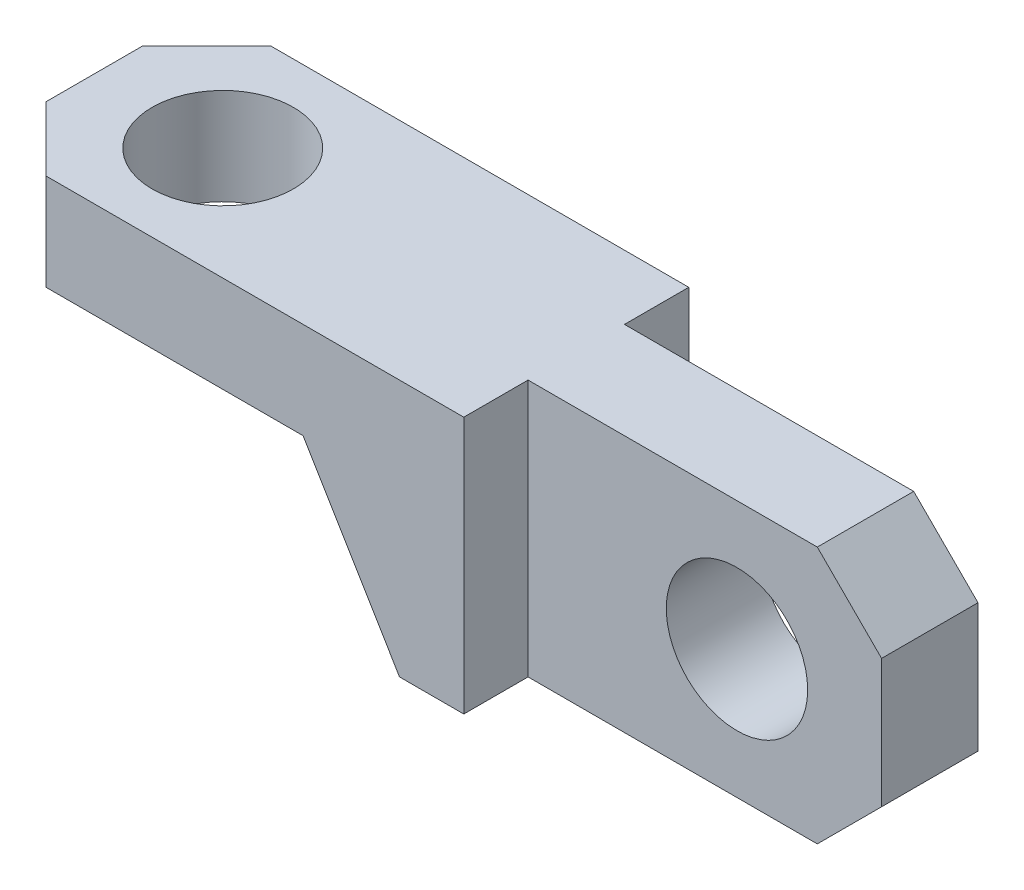
ISO-10303-21;
HEADER;
FILE_DESCRIPTION(('STEP AP214'),'2;1');
FILE_NAME('part.step','',(''),(''),'','','');
FILE_SCHEMA(('AUTOMOTIVE_DESIGN { 1 0 10303 214 1 1 1 1 }'));
ENDSEC;
DATA;
#1=APPLICATION_CONTEXT('core data for automotive mechanical design processes');
#2=APPLICATION_PROTOCOL_DEFINITION('international standard','automotive_design',2000,#1);
#3=PRODUCT_CONTEXT('',#1,'mechanical');
#4=PRODUCT('Part','Part','',(#3));
#5=PRODUCT_RELATED_PRODUCT_CATEGORY('part','',(#4));
#6=PRODUCT_DEFINITION_FORMATION('','',#4);
#7=PRODUCT_DEFINITION_CONTEXT('part definition',#1,'design');
#8=PRODUCT_DEFINITION('design','',#6,#7);
#9=PRODUCT_DEFINITION_SHAPE('','',#8);
#10=(LENGTH_UNIT() NAMED_UNIT(*) SI_UNIT(.MILLI.,.METRE.));
#11=(NAMED_UNIT(*) PLANE_ANGLE_UNIT() SI_UNIT($,.RADIAN.));
#12=(NAMED_UNIT(*) SI_UNIT($,.STERADIAN.) SOLID_ANGLE_UNIT());
#13=UNCERTAINTY_MEASURE_WITH_UNIT(LENGTH_MEASURE(1.E-05),#10,'distance_accuracy_value','');
#14=(GEOMETRIC_REPRESENTATION_CONTEXT(3) GLOBAL_UNCERTAINTY_ASSIGNED_CONTEXT((#13)) GLOBAL_UNIT_ASSIGNED_CONTEXT((#10,
#11,#12)) REPRESENTATION_CONTEXT('',''));
#15=CARTESIAN_POINT('',(0.,0.,0.));
#16=DIRECTION('',(0.,0.,1.));
#17=DIRECTION('',(1.,0.,0.));
#18=AXIS2_PLACEMENT_3D('',#15,#16,#17);
#19=CARTESIAN_POINT('',(0.,10.16,0.));
#20=DIRECTION('',(0.,-1.,0.));
#21=DIRECTION('',(0.,0.,-1.));
#22=AXIS2_PLACEMENT_3D('',#19,#20,#21);
#23=PLANE('',#22);
#24=DIRECTION('',(-1.,0.,0.));
#25=VECTOR('',#24,1.);
#26=CARTESIAN_POINT('',(0.,10.16,-8.89));
#27=LINE('',#26,#25);
#28=CARTESIAN_POINT('',(19.05,10.16,-8.89));
#29=VERTEX_POINT('',#28);
#30=CARTESIAN_POINT('',(2.54000000000001,10.16,-8.89));
#31=VERTEX_POINT('',#30);
#32=EDGE_CURVE('E190',#29,#31,#27,.T.);
#33=ORIENTED_EDGE('',*,*,#32,.T.);
#34=DIRECTION('',(0.707106781186549,0.,-0.707106781186546));
#35=VECTOR('',#34,1.);
#36=CARTESIAN_POINT('',(0.,10.16,-6.35));
#37=LINE('',#36,#35);
#38=CARTESIAN_POINT('',(0.,10.16,-6.35));
#39=VERTEX_POINT('',#38);
#40=EDGE_CURVE('E250',#31,#39,#37,.F.);
#41=ORIENTED_EDGE('',*,*,#40,.T.);
#42=DIRECTION('',(0.,0.,1.));
#43=VECTOR('',#42,1.);
#44=CARTESIAN_POINT('',(0.,10.16,0.));
#45=LINE('',#44,#43);
#46=CARTESIAN_POINT('',(0.,10.16,-2.54000000000001));
#47=VERTEX_POINT('',#46);
#48=EDGE_CURVE('E204',#39,#47,#45,.T.);
#49=ORIENTED_EDGE('',*,*,#48,.T.);
#50=DIRECTION('',(-0.707106781186546,0.,-0.707106781186549));
#51=VECTOR('',#50,1.);
#52=CARTESIAN_POINT('',(2.54,10.16,0.));
#53=LINE('',#52,#51);
#54=CARTESIAN_POINT('',(2.54,10.16,0.));
#55=VERTEX_POINT('',#54);
#56=EDGE_CURVE('E247',#47,#55,#53,.F.);
#57=ORIENTED_EDGE('',*,*,#56,.T.);
#58=DIRECTION('',(1.,0.,0.));
#59=VECTOR('',#58,1.);
#60=CARTESIAN_POINT('',(0.,10.16,0.));
#61=LINE('',#60,#59);
#62=CARTESIAN_POINT('',(19.05,10.16,0.));
#63=VERTEX_POINT('',#62);
#64=EDGE_CURVE('E301',#55,#63,#61,.T.);
#65=ORIENTED_EDGE('',*,*,#64,.T.);
#66=DIRECTION('',(0.,0.,-1.));
#67=VECTOR('',#66,1.);
#68=CARTESIAN_POINT('',(19.05,10.16,0.));
#69=LINE('',#68,#67);
#70=CARTESIAN_POINT('',(19.05,10.16,-2.54));
#71=VERTEX_POINT('',#70);
#72=EDGE_CURVE('E285',#63,#71,#69,.T.);
#73=ORIENTED_EDGE('',*,*,#72,.T.);
#74=DIRECTION('',(1.,0.,0.));
#75=VECTOR('',#74,1.);
#76=CARTESIAN_POINT('',(19.05,10.16,-2.54));
#77=LINE('',#76,#75);
#78=CARTESIAN_POINT('',(30.48,10.16,-2.54));
#79=VERTEX_POINT('',#78);
#80=EDGE_CURVE('E276',#71,#79,#77,.T.);
#81=ORIENTED_EDGE('',*,*,#80,.T.);
#82=DIRECTION('',(0.,0.,-1.));
#83=VECTOR('',#82,1.);
#84=CARTESIAN_POINT('',(30.48,10.16,0.));
#85=LINE('',#84,#83);
#86=CARTESIAN_POINT('',(30.48,10.16,-6.35));
#87=VERTEX_POINT('',#86);
#88=EDGE_CURVE('E243',#79,#87,#85,.T.);
#89=ORIENTED_EDGE('',*,*,#88,.T.);
#90=DIRECTION('',(-1.,0.,0.));
#91=VECTOR('',#90,1.);
#92=CARTESIAN_POINT('',(19.05,10.16,-6.35));
#93=LINE('',#92,#91);
#94=CARTESIAN_POINT('',(19.05,10.16,-6.35));
#95=VERTEX_POINT('',#94);
#96=EDGE_CURVE('E288',#87,#95,#93,.T.);
#97=ORIENTED_EDGE('',*,*,#96,.T.);
#98=DIRECTION('',(0.,0.,-1.));
#99=VECTOR('',#98,1.);
#100=CARTESIAN_POINT('',(19.05,10.16,-8.89));
#101=LINE('',#100,#99);
#102=EDGE_CURVE('E337',#95,#29,#101,.T.);
#103=ORIENTED_EDGE('',*,*,#102,.T.);
#104=EDGE_LOOP('',(#33,#41,#49,#57,#65,#73,#81,#89,#97,#103));
#105=FACE_BOUND('',#104,.T.);
#106=CARTESIAN_POINT('',(5.08,10.16,-4.445));
#107=DIRECTION('',(0.,1.,0.));
#108=DIRECTION('',(0.,0.,1.));
#109=AXIS2_PLACEMENT_3D('',#106,#107,#108);
#110=CIRCLE('',#109,2.794);
#111=CARTESIAN_POINT('',(5.08,10.16,-1.651));
#112=VERTEX_POINT('',#111);
#113=EDGE_CURVE('E180',#112,#112,#110,.T.);
#114=ORIENTED_EDGE('',*,*,#113,.F.);
#115=EDGE_LOOP('',(#114));
#116=FACE_BOUND('',#115,.T.);
#117=ADVANCED_FACE('F47',(#105,#116),#23,.F.);
#118=CARTESIAN_POINT('',(0.,0.,0.));
#119=DIRECTION('',(0.,-1.,0.));
#120=DIRECTION('',(0.,0.,-1.));
#121=AXIS2_PLACEMENT_3D('',#118,#119,#120);
#122=PLANE('',#121);
#123=DIRECTION('',(-1.,0.,0.));
#124=VECTOR('',#123,1.);
#125=CARTESIAN_POINT('',(19.05,0.,-6.35));
#126=LINE('',#125,#124);
#127=CARTESIAN_POINT('',(30.48,0.,-6.35));
#128=VERTEX_POINT('',#127);
#129=CARTESIAN_POINT('',(19.05,0.,-6.35));
#130=VERTEX_POINT('',#129);
#131=EDGE_CURVE('E195',#128,#130,#126,.T.);
#132=ORIENTED_EDGE('',*,*,#131,.F.);
#133=DIRECTION('',(0.,0.,1.));
#134=VECTOR('',#133,1.);
#135=CARTESIAN_POINT('',(30.48,0.,-2.54));
#136=LINE('',#135,#134);
#137=CARTESIAN_POINT('',(30.48,0.,-2.54));
#138=VERTEX_POINT('',#137);
#139=EDGE_CURVE('E64',#128,#138,#136,.T.);
#140=ORIENTED_EDGE('',*,*,#139,.T.);
#141=DIRECTION('',(1.,0.,0.));
#142=VECTOR('',#141,1.);
#143=CARTESIAN_POINT('',(19.05,0.,-2.54));
#144=LINE('',#143,#142);
#145=CARTESIAN_POINT('',(19.05,0.,-2.54));
#146=VERTEX_POINT('',#145);
#147=EDGE_CURVE('E184',#146,#138,#144,.T.);
#148=ORIENTED_EDGE('',*,*,#147,.F.);
#149=DIRECTION('',(0.,0.,-1.));
#150=VECTOR('',#149,1.);
#151=CARTESIAN_POINT('',(19.05,0.,0.));
#152=LINE('',#151,#150);
#153=CARTESIAN_POINT('',(19.05,0.,0.));
#154=VERTEX_POINT('',#153);
#155=EDGE_CURVE('E178',#154,#146,#152,.T.);
#156=ORIENTED_EDGE('',*,*,#155,.F.);
#157=DIRECTION('',(1.,0.,0.));
#158=VECTOR('',#157,1.);
#159=CARTESIAN_POINT('',(0.,0.,0.));
#160=LINE('',#159,#158);
#161=CARTESIAN_POINT('',(16.51,0.,0.));
#162=VERTEX_POINT('',#161);
#163=EDGE_CURVE('E169',#162,#154,#160,.T.);
#164=ORIENTED_EDGE('',*,*,#163,.F.);
#165=DIRECTION('',(0.,0.,1.));
#166=VECTOR('',#165,1.);
#167=CARTESIAN_POINT('',(16.51,0.,-8.891));
#168=LINE('',#167,#166);
#169=CARTESIAN_POINT('',(16.51,0.,-8.89));
#170=VERTEX_POINT('',#169);
#171=EDGE_CURVE('E150',#170,#162,#168,.T.);
#172=ORIENTED_EDGE('',*,*,#171,.F.);
#173=DIRECTION('',(-1.,0.,0.));
#174=VECTOR('',#173,1.);
#175=CARTESIAN_POINT('',(0.,0.,-8.89));
#176=LINE('',#175,#174);
#177=CARTESIAN_POINT('',(19.05,0.,-8.89));
#178=VERTEX_POINT('',#177);
#179=EDGE_CURVE('E201',#178,#170,#176,.T.);
#180=ORIENTED_EDGE('',*,*,#179,.F.);
#181=DIRECTION('',(0.,0.,-1.));
#182=VECTOR('',#181,1.);
#183=CARTESIAN_POINT('',(19.05,0.,-8.89));
#184=LINE('',#183,#182);
#185=EDGE_CURVE('E198',#130,#178,#184,.T.);
#186=ORIENTED_EDGE('',*,*,#185,.F.);
#187=EDGE_LOOP('',(#132,#140,#148,#156,#164,#172,#180,#186));
#188=FACE_BOUND('',#187,.T.);
#189=ADVANCED_FACE('F177',(#188),#122,.T.);
#190=CARTESIAN_POINT('',(0.,10.16,0.));
#191=DIRECTION('',(1.,0.,0.));
#192=DIRECTION('',(0.,0.,-1.));
#193=AXIS2_PLACEMENT_3D('',#190,#191,#192);
#194=PLANE('',#193);
#195=ORIENTED_EDGE('',*,*,#48,.F.);
#196=DIRECTION('',(0.,-1.,0.));
#197=VECTOR('',#196,1.);
#198=CARTESIAN_POINT('',(0.,10.16,-6.35));
#199=LINE('',#198,#197);
#200=CARTESIAN_POINT('',(0.,6.35,-6.35));
#201=VERTEX_POINT('',#200);
#202=EDGE_CURVE('E230',#39,#201,#199,.T.);
#203=ORIENTED_EDGE('',*,*,#202,.T.);
#204=DIRECTION('',(0.,0.,1.));
#205=VECTOR('',#204,1.);
#206=CARTESIAN_POINT('',(0.,6.35,-8.891));
#207=LINE('',#206,#205);
#208=CARTESIAN_POINT('',(0.,6.35,-2.54000000000001));
#209=VERTEX_POINT('',#208);
#210=EDGE_CURVE('E313',#201,#209,#207,.T.);
#211=ORIENTED_EDGE('',*,*,#210,.T.);
#212=DIRECTION('',(0.,1.,0.));
#213=VECTOR('',#212,1.);
#214=CARTESIAN_POINT('',(0.,10.16,-2.54000000000001));
#215=LINE('',#214,#213);
#216=EDGE_CURVE('E227',#209,#47,#215,.T.);
#217=ORIENTED_EDGE('',*,*,#216,.T.);
#218=EDGE_LOOP('',(#195,#203,#211,#217));
#219=FACE_BOUND('',#218,.T.);
#220=ADVANCED_FACE('F316',(#219),#194,.F.);
#221=CARTESIAN_POINT('',(0.,10.16,0.));
#222=DIRECTION('',(0.,0.,-1.));
#223=DIRECTION('',(-1.,0.,0.));
#224=AXIS2_PLACEMENT_3D('',#221,#222,#223);
#225=PLANE('',#224);
#226=ORIENTED_EDGE('',*,*,#64,.F.);
#227=DIRECTION('',(0.,-1.,0.));
#228=VECTOR('',#227,1.);
#229=CARTESIAN_POINT('',(2.54,10.16,0.));
#230=LINE('',#229,#228);
#231=CARTESIAN_POINT('',(2.54,6.35,0.));
#232=VERTEX_POINT('',#231);
#233=EDGE_CURVE('E253',#55,#232,#230,.T.);
#234=ORIENTED_EDGE('',*,*,#233,.T.);
#235=DIRECTION('',(-1.,0.,0.));
#236=VECTOR('',#235,1.);
#237=CARTESIAN_POINT('',(0.,6.35,0.));
#238=LINE('',#237,#236);
#239=CARTESIAN_POINT('',(12.7,6.35,0.));
#240=VERTEX_POINT('',#239);
#241=EDGE_CURVE('E163',#240,#232,#238,.T.);
#242=ORIENTED_EDGE('',*,*,#241,.F.);
#243=DIRECTION('',(-0.514495755427526,0.857492925712544,0.));
#244=VECTOR('',#243,1.);
#245=CARTESIAN_POINT('',(12.7,6.35,0.));
#246=LINE('',#245,#244);
#247=EDGE_CURVE('E154',#162,#240,#246,.T.);
#248=ORIENTED_EDGE('',*,*,#247,.F.);
#249=ORIENTED_EDGE('',*,*,#163,.T.);
#250=DIRECTION('',(0.,-1.,0.));
#251=VECTOR('',#250,1.);
#252=CARTESIAN_POINT('',(19.05,10.16,0.));
#253=LINE('',#252,#251);
#254=EDGE_CURVE('E224',#63,#154,#253,.T.);
#255=ORIENTED_EDGE('',*,*,#254,.F.);
#256=EDGE_LOOP('',(#226,#234,#242,#248,#249,#255));
#257=FACE_BOUND('',#256,.T.);
#258=ADVANCED_FACE('F167',(#257),#225,.F.);
#259=CARTESIAN_POINT('',(19.05,10.16,0.));
#260=DIRECTION('',(-1.,0.,0.));
#261=DIRECTION('',(0.,0.,1.));
#262=AXIS2_PLACEMENT_3D('',#259,#260,#261);
#263=PLANE('',#262);
#264=ORIENTED_EDGE('',*,*,#155,.T.);
#265=DIRECTION('',(0.,-1.,0.));
#266=VECTOR('',#265,1.);
#267=CARTESIAN_POINT('',(19.05,10.16,-2.54));
#268=LINE('',#267,#266);
#269=EDGE_CURVE('E220',#71,#146,#268,.T.);
#270=ORIENTED_EDGE('',*,*,#269,.F.);
#271=ORIENTED_EDGE('',*,*,#72,.F.);
#272=ORIENTED_EDGE('',*,*,#254,.T.);
#273=EDGE_LOOP('',(#264,#270,#271,#272));
#274=FACE_BOUND('',#273,.T.);
#275=ADVANCED_FACE('F300',(#274),#263,.F.);
#276=CARTESIAN_POINT('',(19.05,10.16,-2.54));
#277=DIRECTION('',(0.,0.,-1.));
#278=DIRECTION('',(-1.,0.,0.));
#279=AXIS2_PLACEMENT_3D('',#276,#277,#278);
#280=PLANE('',#279);
#281=CARTESIAN_POINT('',(27.305,5.08,-2.54));
#282=DIRECTION('',(0.,0.,1.));
#283=DIRECTION('',(1.,0.,0.));
#284=AXIS2_PLACEMENT_3D('',#281,#282,#283);
#285=CIRCLE('',#284,2.794);
#286=CARTESIAN_POINT('',(30.099,5.08,-2.54));
#287=VERTEX_POINT('',#286);
#288=EDGE_CURVE('E320',#287,#287,#285,.T.);
#289=ORIENTED_EDGE('',*,*,#288,.F.);
#290=EDGE_LOOP('',(#289));
#291=FACE_BOUND('',#290,.T.);
#292=ORIENTED_EDGE('',*,*,#147,.T.);
#293=DIRECTION('',(0.707106781186549,0.707106781186546,0.));
#294=VECTOR('',#293,1.);
#295=CARTESIAN_POINT('',(33.02,2.54,-2.54));
#296=LINE('',#295,#294);
#297=CARTESIAN_POINT('',(33.02,2.54,-2.54));
#298=VERTEX_POINT('',#297);
#299=EDGE_CURVE('E11',#138,#298,#296,.T.);
#300=ORIENTED_EDGE('',*,*,#299,.T.);
#301=DIRECTION('',(0.,-1.,0.));
#302=VECTOR('',#301,1.);
#303=CARTESIAN_POINT('',(33.02,10.16,-2.54));
#304=LINE('',#303,#302);
#305=CARTESIAN_POINT('',(33.02,7.61999999999999,-2.54));
#306=VERTEX_POINT('',#305);
#307=EDGE_CURVE('E216',#306,#298,#304,.T.);
#308=ORIENTED_EDGE('',*,*,#307,.F.);
#309=DIRECTION('',(0.707106781186547,-0.707106781186548,0.));
#310=VECTOR('',#309,1.);
#311=CARTESIAN_POINT('',(30.48,10.16,-2.54));
#312=LINE('',#311,#310);
#313=EDGE_CURVE('E57',#306,#79,#312,.F.);
#314=ORIENTED_EDGE('',*,*,#313,.T.);
#315=ORIENTED_EDGE('',*,*,#80,.F.);
#316=ORIENTED_EDGE('',*,*,#269,.T.);
#317=EDGE_LOOP('',(#292,#300,#308,#314,#315,#316));
#318=FACE_BOUND('',#317,.T.);
#319=ADVANCED_FACE('F275',(#291,#318),#280,.F.);
#320=CARTESIAN_POINT('',(33.02,10.16,-2.54));
#321=DIRECTION('',(-1.,0.,0.));
#322=DIRECTION('',(0.,0.,1.));
#323=AXIS2_PLACEMENT_3D('',#320,#321,#322);
#324=PLANE('',#323);
#325=ORIENTED_EDGE('',*,*,#307,.T.);
#326=DIRECTION('',(0.,0.,-1.));
#327=VECTOR('',#326,1.);
#328=CARTESIAN_POINT('',(33.02,2.54,-6.35));
#329=LINE('',#328,#327);
#330=CARTESIAN_POINT('',(33.02,2.54,-6.35));
#331=VERTEX_POINT('',#330);
#332=EDGE_CURVE('E259',#298,#331,#329,.T.);
#333=ORIENTED_EDGE('',*,*,#332,.T.);
#334=DIRECTION('',(0.,-1.,0.));
#335=VECTOR('',#334,1.);
#336=CARTESIAN_POINT('',(33.02,10.16,-6.35));
#337=LINE('',#336,#335);
#338=CARTESIAN_POINT('',(33.02,7.61999999999999,-6.35));
#339=VERTEX_POINT('',#338);
#340=EDGE_CURVE('E213',#339,#331,#337,.T.);
#341=ORIENTED_EDGE('',*,*,#340,.F.);
#342=DIRECTION('',(0.,0.,1.));
#343=VECTOR('',#342,1.);
#344=CARTESIAN_POINT('',(33.02,7.61999999999999,-2.54));
#345=LINE('',#344,#343);
#346=EDGE_CURVE('E256',#339,#306,#345,.T.);
#347=ORIENTED_EDGE('',*,*,#346,.T.);
#348=EDGE_LOOP('',(#325,#333,#341,#347));
#349=FACE_BOUND('',#348,.T.);
#350=ADVANCED_FACE('F294',(#349),#324,.F.);
#351=CARTESIAN_POINT('',(19.05,10.16,-6.35));
#352=DIRECTION('',(0.,0.,1.));
#353=DIRECTION('',(1.,0.,0.));
#354=AXIS2_PLACEMENT_3D('',#351,#352,#353);
#355=PLANE('',#354);
#356=CARTESIAN_POINT('',(27.305,5.08,-6.35));
#357=DIRECTION('',(0.,0.,1.));
#358=DIRECTION('',(1.,0.,0.));
#359=AXIS2_PLACEMENT_3D('',#356,#357,#358);
#360=CIRCLE('',#359,2.794);
#361=CARTESIAN_POINT('',(30.099,5.08,-6.35));
#362=VERTEX_POINT('',#361);
#363=EDGE_CURVE('E187',#362,#362,#360,.F.);
#364=ORIENTED_EDGE('',*,*,#363,.F.);
#365=EDGE_LOOP('',(#364));
#366=FACE_BOUND('',#365,.T.);
#367=ORIENTED_EDGE('',*,*,#340,.T.);
#368=DIRECTION('',(-0.707106781186549,-0.707106781186546,0.));
#369=VECTOR('',#368,1.);
#370=CARTESIAN_POINT('',(33.02,2.54,-6.35));
#371=LINE('',#370,#369);
#372=EDGE_CURVE('E72',#331,#128,#371,.T.);
#373=ORIENTED_EDGE('',*,*,#372,.T.);
#374=ORIENTED_EDGE('',*,*,#131,.T.);
#375=DIRECTION('',(0.,-1.,0.));
#376=VECTOR('',#375,1.);
#377=CARTESIAN_POINT('',(19.05,10.16,-6.35));
#378=LINE('',#377,#376);
#379=EDGE_CURVE('E209',#95,#130,#378,.T.);
#380=ORIENTED_EDGE('',*,*,#379,.F.);
#381=ORIENTED_EDGE('',*,*,#96,.F.);
#382=DIRECTION('',(-0.707106781186547,0.707106781186548,0.));
#383=VECTOR('',#382,1.);
#384=CARTESIAN_POINT('',(30.48,10.16,-6.35));
#385=LINE('',#384,#383);
#386=EDGE_CURVE('E263',#87,#339,#385,.F.);
#387=ORIENTED_EDGE('',*,*,#386,.T.);
#388=EDGE_LOOP('',(#367,#373,#374,#380,#381,#387));
#389=FACE_BOUND('',#388,.T.);
#390=ADVANCED_FACE('F291',(#366,#389),#355,.F.);
#391=CARTESIAN_POINT('',(19.05,10.16,-8.89));
#392=DIRECTION('',(-1.,0.,0.));
#393=DIRECTION('',(0.,0.,1.));
#394=AXIS2_PLACEMENT_3D('',#391,#392,#393);
#395=PLANE('',#394);
#396=ORIENTED_EDGE('',*,*,#185,.T.);
#397=DIRECTION('',(0.,-1.,0.));
#398=VECTOR('',#397,1.);
#399=CARTESIAN_POINT('',(19.05,10.16,-8.89));
#400=LINE('',#399,#398);
#401=EDGE_CURVE('E205',#29,#178,#400,.T.);
#402=ORIENTED_EDGE('',*,*,#401,.F.);
#403=ORIENTED_EDGE('',*,*,#102,.F.);
#404=ORIENTED_EDGE('',*,*,#379,.T.);
#405=EDGE_LOOP('',(#396,#402,#403,#404));
#406=FACE_BOUND('',#405,.T.);
#407=ADVANCED_FACE('F384',(#406),#395,.F.);
#408=CARTESIAN_POINT('',(0.,10.16,-8.89));
#409=DIRECTION('',(0.,0.,1.));
#410=DIRECTION('',(1.,0.,0.));
#411=AXIS2_PLACEMENT_3D('',#408,#409,#410);
#412=PLANE('',#411);
#413=DIRECTION('',(1.,0.,0.));
#414=VECTOR('',#413,1.);
#415=CARTESIAN_POINT('',(0.,6.35,-8.89));
#416=LINE('',#415,#414);
#417=CARTESIAN_POINT('',(2.54000000000001,6.35,-8.89));
#418=VERTEX_POINT('',#417);
#419=CARTESIAN_POINT('',(12.7,6.35,-8.89));
#420=VERTEX_POINT('',#419);
#421=EDGE_CURVE('E174',#418,#420,#416,.T.);
#422=ORIENTED_EDGE('',*,*,#421,.F.);
#423=DIRECTION('',(0.,1.,0.));
#424=VECTOR('',#423,1.);
#425=CARTESIAN_POINT('',(2.54000000000001,10.16,-8.89));
#426=LINE('',#425,#424);
#427=EDGE_CURVE('E240',#418,#31,#426,.T.);
#428=ORIENTED_EDGE('',*,*,#427,.T.);
#429=ORIENTED_EDGE('',*,*,#32,.F.);
#430=ORIENTED_EDGE('',*,*,#401,.T.);
#431=ORIENTED_EDGE('',*,*,#179,.T.);
#432=DIRECTION('',(0.514495755427527,-0.857492925712544,0.));
#433=VECTOR('',#432,1.);
#434=CARTESIAN_POINT('',(12.7,6.35,-8.89));
#435=LINE('',#434,#433);
#436=EDGE_CURVE('E157',#420,#170,#435,.T.);
#437=ORIENTED_EDGE('',*,*,#436,.F.);
#438=EDGE_LOOP('',(#422,#428,#429,#430,#431,#437));
#439=FACE_BOUND('',#438,.T.);
#440=ADVANCED_FACE('F349',(#439),#412,.F.);
#441=CARTESIAN_POINT('',(5.08,10.16,-4.445));
#442=DIRECTION('',(0.,-1.,0.));
#443=DIRECTION('',(0.,0.,-1.));
#444=AXIS2_PLACEMENT_3D('',#441,#442,#443);
#445=CYLINDRICAL_SURFACE('',#444,2.794);
#446=CARTESIAN_POINT('',(5.08,6.35,-4.445));
#447=DIRECTION('',(0.,1.,0.));
#448=DIRECTION('',(0.,0.,1.));
#449=AXIS2_PLACEMENT_3D('',#446,#447,#448);
#450=CIRCLE('',#449,2.794);
#451=CARTESIAN_POINT('',(5.08,6.35,-1.651));
#452=VERTEX_POINT('',#451);
#453=EDGE_CURVE('E353',#452,#452,#450,.F.);
#454=ORIENTED_EDGE('',*,*,#453,.T.);
#455=EDGE_LOOP('',(#454));
#456=FACE_BOUND('',#455,.T.);
#457=ORIENTED_EDGE('',*,*,#113,.T.);
#458=EDGE_LOOP('',(#457));
#459=FACE_BOUND('',#458,.T.);
#460=ADVANCED_FACE('F360',(#456,#459),#445,.F.);
#461=CARTESIAN_POINT('',(27.305,5.08,-8.891));
#462=DIRECTION('',(0.,0.,1.));
#463=DIRECTION('',(1.,0.,0.));
#464=AXIS2_PLACEMENT_3D('',#461,#462,#463);
#465=CYLINDRICAL_SURFACE('',#464,2.794);
#466=CARTESIAN_POINT('',(30.099,5.08,-2.54));
#467=CARTESIAN_POINT('',(30.099,5.08,-2.5796875));
#468=CARTESIAN_POINT('',(30.099,5.08,-2.619375));
#469=CARTESIAN_POINT('',(30.099,5.08,-2.69875));
#470=CARTESIAN_POINT('',(30.099,5.08,-2.7384375));
#471=CARTESIAN_POINT('',(30.099,5.08,-2.8178125));
#472=CARTESIAN_POINT('',(30.099,5.08,-2.8575));
#473=CARTESIAN_POINT('',(30.099,5.08,-2.936875));
#474=CARTESIAN_POINT('',(30.099,5.08,-2.9765625));
#475=CARTESIAN_POINT('',(30.099,5.08,-3.0559375));
#476=CARTESIAN_POINT('',(30.099,5.08,-3.095625));
#477=CARTESIAN_POINT('',(30.099,5.08,-3.175));
#478=CARTESIAN_POINT('',(30.099,5.08,-3.2146875));
#479=CARTESIAN_POINT('',(30.099,5.08,-3.2940625));
#480=CARTESIAN_POINT('',(30.099,5.08,-3.33375));
#481=CARTESIAN_POINT('',(30.099,5.08,-3.413125));
#482=CARTESIAN_POINT('',(30.099,5.08,-3.4528125));
#483=CARTESIAN_POINT('',(30.099,5.08,-3.5321875));
#484=CARTESIAN_POINT('',(30.099,5.08,-3.571875));
#485=CARTESIAN_POINT('',(30.099,5.08,-3.65125));
#486=CARTESIAN_POINT('',(30.099,5.08,-3.6909375));
#487=CARTESIAN_POINT('',(30.099,5.08,-3.7703125));
#488=CARTESIAN_POINT('',(30.099,5.08,-3.81));
#489=CARTESIAN_POINT('',(30.099,5.08,-3.889375));
#490=CARTESIAN_POINT('',(30.099,5.08,-3.9290625));
#491=CARTESIAN_POINT('',(30.099,5.08,-4.0084375));
#492=CARTESIAN_POINT('',(30.099,5.08,-4.048125));
#493=CARTESIAN_POINT('',(30.099,5.08,-4.1275));
#494=CARTESIAN_POINT('',(30.099,5.08,-4.1671875));
#495=CARTESIAN_POINT('',(30.099,5.08,-4.2465625));
#496=CARTESIAN_POINT('',(30.099,5.08,-4.28625));
#497=CARTESIAN_POINT('',(30.099,5.08,-4.365625));
#498=CARTESIAN_POINT('',(30.099,5.08,-4.4053125));
#499=CARTESIAN_POINT('',(30.099,5.08,-4.4846875));
#500=CARTESIAN_POINT('',(30.099,5.08,-4.524375));
#501=CARTESIAN_POINT('',(30.099,5.08,-4.60375));
#502=CARTESIAN_POINT('',(30.099,5.08,-4.6434375));
#503=CARTESIAN_POINT('',(30.099,5.08,-4.7228125));
#504=CARTESIAN_POINT('',(30.099,5.08,-4.7625));
#505=CARTESIAN_POINT('',(30.099,5.08,-4.841875));
#506=CARTESIAN_POINT('',(30.099,5.08,-4.8815625));
#507=CARTESIAN_POINT('',(30.099,5.08,-4.9609375));
#508=CARTESIAN_POINT('',(30.099,5.08,-5.000625));
#509=CARTESIAN_POINT('',(30.099,5.08,-5.08));
#510=CARTESIAN_POINT('',(30.099,5.08,-5.1196875));
#511=CARTESIAN_POINT('',(30.099,5.08,-5.1990625));
#512=CARTESIAN_POINT('',(30.099,5.08,-5.23875));
#513=CARTESIAN_POINT('',(30.099,5.08,-5.318125));
#514=CARTESIAN_POINT('',(30.099,5.08,-5.3578125));
#515=CARTESIAN_POINT('',(30.099,5.08,-5.4371875));
#516=CARTESIAN_POINT('',(30.099,5.08,-5.476875));
#517=CARTESIAN_POINT('',(30.099,5.08,-5.55625));
#518=CARTESIAN_POINT('',(30.099,5.08,-5.5959375));
#519=CARTESIAN_POINT('',(30.099,5.08,-5.6753125));
#520=CARTESIAN_POINT('',(30.099,5.08,-5.715));
#521=CARTESIAN_POINT('',(30.099,5.08,-5.794375));
#522=CARTESIAN_POINT('',(30.099,5.08,-5.8340625));
#523=CARTESIAN_POINT('',(30.099,5.08,-5.9134375));
#524=CARTESIAN_POINT('',(30.099,5.08,-5.953125));
#525=CARTESIAN_POINT('',(30.099,5.08,-6.0325));
#526=CARTESIAN_POINT('',(30.099,5.08,-6.0721875));
#527=CARTESIAN_POINT('',(30.099,5.08,-6.1515625));
#528=CARTESIAN_POINT('',(30.099,5.08,-6.19125));
#529=CARTESIAN_POINT('',(30.099,5.08,-6.270625));
#530=CARTESIAN_POINT('',(30.099,5.08,-6.3103125));
#531=CARTESIAN_POINT('',(30.099,5.08,-6.35));
#532=B_SPLINE_CURVE_WITH_KNOTS('',3,(#466,#467,#468,#469,#470,#471,#472,#473,#474,#475,#476,
#477,#478,#479,#480,#481,#482,#483,#484,#485,#486,#487,#488,#489,#490,#491,#492,#493,#494,#495,
#496,#497,#498,#499,#500,#501,#502,#503,#504,#505,#506,#507,#508,#509,#510,#511,#512,#513,#514,
#515,#516,#517,#518,#519,#520,#521,#522,#523,#524,#525,#526,#527,#528,#529,#530,#531),
.UNSPECIFIED.,.F.,.F.,(4,2,2,2,2,2,2,2,2,2,2,2,2,2,2,2,2,2,2,2,2,2,2,2,2,2,2,2,2,2,2,2,4),(0.,
0.1190625,0.238125,0.3571875,0.47625,0.5953125,0.714375,0.8334375,0.9525,1.0715625,1.190625,
1.3096875,1.42875,1.5478125,1.666875,1.7859375,1.905,2.0240625,2.143125,2.2621875,2.38125,
2.5003125,2.619375,2.7384375,2.8575,2.9765625,3.095625,3.2146875,3.33375,3.4528125,3.571875,
3.6909375,3.81),.UNSPECIFIED.);
#533=EDGE_CURVE('BSEAM364',#287,#362,#532,.T.);
#534=ORIENTED_EDGE('',*,*,#288,.T.);
#535=ORIENTED_EDGE('',*,*,#363,.T.);
#536=ORIENTED_EDGE('',*,*,#533,.T.);
#537=ORIENTED_EDGE('',*,*,#533,.F.);
#538=EDGE_LOOP('',(#534,#536,#535,#537));
#539=FACE_BOUND('',#538,.T.);
#540=ADVANCED_FACE('F364',(#539),#465,.F.);
#541=CARTESIAN_POINT('',(0.,6.35,-8.891));
#542=DIRECTION('',(0.,1.,0.));
#543=DIRECTION('',(0.,0.,1.));
#544=AXIS2_PLACEMENT_3D('',#541,#542,#543);
#545=PLANE('',#544);
#546=ORIENTED_EDGE('',*,*,#453,.F.);
#547=EDGE_LOOP('',(#546));
#548=FACE_BOUND('',#547,.T.);
#549=ORIENTED_EDGE('',*,*,#210,.F.);
#550=DIRECTION('',(-0.707106781186549,0.,0.707106781186546));
#551=VECTOR('',#550,1.);
#552=CARTESIAN_POINT('',(0.,6.35,-6.35));
#553=LINE('',#552,#551);
#554=EDGE_CURVE('E237',#201,#418,#553,.F.);
#555=ORIENTED_EDGE('',*,*,#554,.T.);
#556=ORIENTED_EDGE('',*,*,#421,.T.);
#557=DIRECTION('',(0.,0.,1.));
#558=VECTOR('',#557,1.);
#559=CARTESIAN_POINT('',(12.7,6.35,-8.891));
#560=LINE('',#559,#558);
#561=EDGE_CURVE('E162',#420,#240,#560,.T.);
#562=ORIENTED_EDGE('',*,*,#561,.T.);
#563=ORIENTED_EDGE('',*,*,#241,.T.);
#564=DIRECTION('',(0.707106781186546,0.,0.707106781186549));
#565=VECTOR('',#564,1.);
#566=CARTESIAN_POINT('',(2.54,6.35,0.));
#567=LINE('',#566,#565);
#568=EDGE_CURVE('E234',#232,#209,#567,.F.);
#569=ORIENTED_EDGE('',*,*,#568,.T.);
#570=EDGE_LOOP('',(#549,#555,#556,#562,#563,#569));
#571=FACE_BOUND('',#570,.T.);
#572=ADVANCED_FACE('F312',(#548,#571),#545,.F.);
#573=CARTESIAN_POINT('',(12.7,6.35,-8.891));
#574=DIRECTION('',(0.857492925712544,0.514495755427527,0.));
#575=DIRECTION('',(-0.514495755427527,0.857492925712544,0.));
#576=AXIS2_PLACEMENT_3D('',#573,#574,#575);
#577=PLANE('',#576);
#578=ORIENTED_EDGE('',*,*,#436,.T.);
#579=ORIENTED_EDGE('',*,*,#171,.T.);
#580=ORIENTED_EDGE('',*,*,#247,.T.);
#581=ORIENTED_EDGE('',*,*,#561,.F.);
#582=EDGE_LOOP('',(#578,#579,#580,#581));
#583=FACE_BOUND('',#582,.T.);
#584=ADVANCED_FACE('F152',(#583),#577,.F.);
#585=CARTESIAN_POINT('',(0.,10.16,-6.35));
#586=DIRECTION('',(0.707106781186546,0.,0.707106781186549));
#587=DIRECTION('',(0.,-1.,0.));
#588=AXIS2_PLACEMENT_3D('',#585,#586,#587);
#589=PLANE('',#588);
#590=ORIENTED_EDGE('',*,*,#40,.F.);
#591=ORIENTED_EDGE('',*,*,#427,.F.);
#592=ORIENTED_EDGE('',*,*,#554,.F.);
#593=ORIENTED_EDGE('',*,*,#202,.F.);
#594=EDGE_LOOP('',(#590,#591,#592,#593));
#595=FACE_BOUND('',#594,.T.);
#596=ADVANCED_FACE('F347',(#595),#589,.F.);
#597=CARTESIAN_POINT('',(2.54,10.16,0.));
#598=DIRECTION('',(0.707106781186549,0.,-0.707106781186546));
#599=DIRECTION('',(0.,-1.,0.));
#600=AXIS2_PLACEMENT_3D('',#597,#598,#599);
#601=PLANE('',#600);
#602=ORIENTED_EDGE('',*,*,#56,.F.);
#603=ORIENTED_EDGE('',*,*,#216,.F.);
#604=ORIENTED_EDGE('',*,*,#568,.F.);
#605=ORIENTED_EDGE('',*,*,#233,.F.);
#606=EDGE_LOOP('',(#602,#603,#604,#605));
#607=FACE_BOUND('',#606,.T.);
#608=ADVANCED_FACE('F307',(#607),#601,.F.);
#609=CARTESIAN_POINT('',(33.02,2.54,-2.54));
#610=DIRECTION('',(0.707106781186546,-0.707106781186549,0.));
#611=DIRECTION('',(0.,0.,1.));
#612=AXIS2_PLACEMENT_3D('',#609,#610,#611);
#613=PLANE('',#612);
#614=ORIENTED_EDGE('',*,*,#299,.F.);
#615=ORIENTED_EDGE('',*,*,#139,.F.);
#616=ORIENTED_EDGE('',*,*,#372,.F.);
#617=ORIENTED_EDGE('',*,*,#332,.F.);
#618=EDGE_LOOP('',(#614,#615,#616,#617));
#619=FACE_BOUND('',#618,.T.);
#620=ADVANCED_FACE('F298',(#619),#613,.T.);
#621=CARTESIAN_POINT('',(30.48,10.16,0.));
#622=DIRECTION('',(-0.707106781186548,-0.707106781186547,0.));
#623=DIRECTION('',(0.,0.,-1.));
#624=AXIS2_PLACEMENT_3D('',#621,#622,#623);
#625=PLANE('',#624);
#626=ORIENTED_EDGE('',*,*,#313,.F.);
#627=ORIENTED_EDGE('',*,*,#346,.F.);
#628=ORIENTED_EDGE('',*,*,#386,.F.);
#629=ORIENTED_EDGE('',*,*,#88,.F.);
#630=EDGE_LOOP('',(#626,#627,#628,#629));
#631=FACE_BOUND('',#630,.T.);
#632=ADVANCED_FACE('F50',(#631),#625,.F.);
#633=CLOSED_SHELL('',(#117,#189,#220,#258,#275,#319,#350,#390,#407,#440,#460,#540,#572,#584,
#596,#608,#620,#632));
#634=MANIFOLD_SOLID_BREP('B2',#633);
#635=ADVANCED_BREP_SHAPE_REPRESENTATION('',(#18,#634),#14);
#636=SHAPE_DEFINITION_REPRESENTATION(#9,#635);
ENDSEC;
END-ISO-10303-21;
